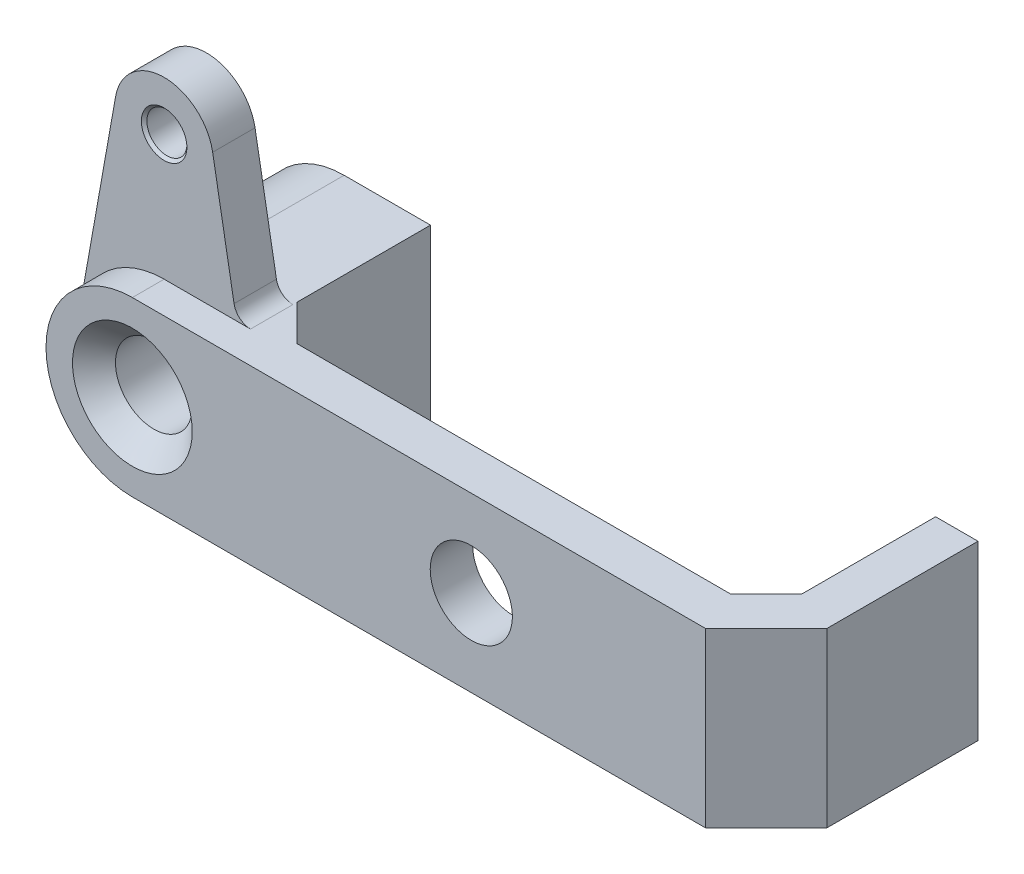
ISO-10303-21;
HEADER;
FILE_DESCRIPTION(('STEP AP214'),'2;1');
FILE_NAME('part.step','',(''),(''),'','','');
FILE_SCHEMA(('AUTOMOTIVE_DESIGN { 1 0 10303 214 1 1 1 1 }'));
ENDSEC;
DATA;
#1=APPLICATION_CONTEXT('core data for automotive mechanical design processes');
#2=APPLICATION_PROTOCOL_DEFINITION('international standard','automotive_design',2000,#1);
#3=PRODUCT_CONTEXT('',#1,'mechanical');
#4=PRODUCT('Part','Part','',(#3));
#5=PRODUCT_RELATED_PRODUCT_CATEGORY('part','',(#4));
#6=PRODUCT_DEFINITION_FORMATION('','',#4);
#7=PRODUCT_DEFINITION_CONTEXT('part definition',#1,'design');
#8=PRODUCT_DEFINITION('design','',#6,#7);
#9=PRODUCT_DEFINITION_SHAPE('','',#8);
#10=(LENGTH_UNIT() NAMED_UNIT(*) SI_UNIT(.MILLI.,.METRE.));
#11=(NAMED_UNIT(*) PLANE_ANGLE_UNIT() SI_UNIT($,.RADIAN.));
#12=(NAMED_UNIT(*) SI_UNIT($,.STERADIAN.) SOLID_ANGLE_UNIT());
#13=UNCERTAINTY_MEASURE_WITH_UNIT(LENGTH_MEASURE(1.E-05),#10,'distance_accuracy_value','');
#14=(GEOMETRIC_REPRESENTATION_CONTEXT(3) GLOBAL_UNCERTAINTY_ASSIGNED_CONTEXT((#13)) GLOBAL_UNIT_ASSIGNED_CONTEXT((#10,
#11,#12)) REPRESENTATION_CONTEXT('',''));
#15=CARTESIAN_POINT('',(0.,0.,0.));
#16=DIRECTION('',(0.,0.,1.));
#17=DIRECTION('',(1.,0.,0.));
#18=AXIS2_PLACEMENT_3D('',#15,#16,#17);
#19=CARTESIAN_POINT('',(86.3209999999999,18.6495,0.));
#20=DIRECTION('',(1.,0.,0.));
#21=DIRECTION('',(0.,1.,0.));
#22=AXIS2_PLACEMENT_3D('',#19,#20,#21);
#23=PLANE('',#22);
#24=DIRECTION('',(0.,0.,1.));
#25=VECTOR('',#24,1.);
#26=CARTESIAN_POINT('',(86.3209999999999,18.6495,0.));
#27=LINE('',#26,#25);
#28=CARTESIAN_POINT('',(86.3209999999999,18.6495,25.4));
#29=VERTEX_POINT('',#28);
#30=CARTESIAN_POINT('',(86.3209999999999,18.6495,43.4976819587423));
#31=VERTEX_POINT('',#30);
#32=EDGE_CURVE('E393',#29,#31,#27,.T.);
#33=ORIENTED_EDGE('',*,*,#32,.F.);
#34=DIRECTION('',(0.,1.,0.));
#35=VECTOR('',#34,1.);
#36=CARTESIAN_POINT('',(86.3209999999999,18.6495,25.4));
#37=LINE('',#36,#35);
#38=CARTESIAN_POINT('',(86.3209999999999,39.3505000000001,25.4));
#39=VERTEX_POINT('',#38);
#40=EDGE_CURVE('E64',#29,#39,#37,.T.);
#41=ORIENTED_EDGE('',*,*,#40,.T.);
#42=DIRECTION('',(0.,0.,1.));
#43=VECTOR('',#42,1.);
#44=CARTESIAN_POINT('',(86.3210000000002,39.3505000000001,0.));
#45=LINE('',#44,#43);
#46=CARTESIAN_POINT('',(86.3209999999999,39.3505000000001,43.4976819587422));
#47=VERTEX_POINT('',#46);
#48=EDGE_CURVE('E484',#47,#39,#45,.F.);
#49=ORIENTED_EDGE('',*,*,#48,.F.);
#50=DIRECTION('',(0.,1.,0.));
#51=VECTOR('',#50,1.);
#52=CARTESIAN_POINT('',(86.3209999999999,18.6495,43.4976819587423));
#53=LINE('',#52,#51);
#54=EDGE_CURVE('E308',#31,#47,#53,.T.);
#55=ORIENTED_EDGE('',*,*,#54,.F.);
#56=EDGE_LOOP('',(#33,#41,#49,#55));
#57=FACE_BOUND('',#56,.T.);
#58=ADVANCED_FACE('F46',(#57),#23,.T.);
#59=CARTESIAN_POINT('',(20.701,18.6495,5.08));
#60=DIRECTION('',(1.,0.,0.));
#61=DIRECTION('',(0.,0.,-1.));
#62=AXIS2_PLACEMENT_3D('',#59,#60,#61);
#63=PLANE('',#62);
#64=DIRECTION('',(0.,0.,1.));
#65=VECTOR('',#64,1.);
#66=CARTESIAN_POINT('',(20.701,18.6495,0.));
#67=LINE('',#66,#65);
#68=CARTESIAN_POINT('',(20.701,18.6495,25.4));
#69=VERTEX_POINT('',#68);
#70=CARTESIAN_POINT('',(20.701,18.6495,41.3934770618868));
#71=VERTEX_POINT('',#70);
#72=EDGE_CURVE('E198',#69,#71,#67,.T.);
#73=ORIENTED_EDGE('',*,*,#72,.F.);
#74=DIRECTION('',(0.,1.,0.));
#75=VECTOR('',#74,1.);
#76=CARTESIAN_POINT('',(20.701,18.6495,25.4));
#77=LINE('',#76,#75);
#78=CARTESIAN_POINT('',(20.701,39.3505000000001,25.4));
#79=VERTEX_POINT('',#78);
#80=EDGE_CURVE('E72',#69,#79,#77,.T.);
#81=ORIENTED_EDGE('',*,*,#80,.T.);
#82=DIRECTION('',(0.,0.,1.));
#83=VECTOR('',#82,1.);
#84=CARTESIAN_POINT('',(20.701,39.3505000000001,0.));
#85=LINE('',#84,#83);
#86=CARTESIAN_POINT('',(20.701,39.3505000000001,41.3934770618868));
#87=VERTEX_POINT('',#86);
#88=EDGE_CURVE('E331',#87,#79,#85,.F.);
#89=ORIENTED_EDGE('',*,*,#88,.F.);
#90=DIRECTION('',(0.,-1.,0.));
#91=VECTOR('',#90,1.);
#92=CARTESIAN_POINT('',(20.701,18.6495,41.3934770618868));
#93=LINE('',#92,#91);
#94=EDGE_CURVE('E330',#87,#71,#93,.T.);
#95=ORIENTED_EDGE('',*,*,#94,.T.);
#96=EDGE_LOOP('',(#73,#81,#89,#95));
#97=FACE_BOUND('',#96,.T.);
#98=ADVANCED_FACE('F545',(#97),#63,.T.);
#99=CARTESIAN_POINT('',(81.2409999999999,39.3505000000001,5.08));
#100=DIRECTION('',(-1.,0.,0.));
#101=DIRECTION('',(0.,0.,1.));
#102=AXIS2_PLACEMENT_3D('',#99,#100,#101);
#103=PLANE('',#102);
#104=DIRECTION('',(0.,0.,1.));
#105=VECTOR('',#104,1.);
#106=CARTESIAN_POINT('',(81.2409999999999,39.3505000000001,0.));
#107=LINE('',#106,#105);
#108=CARTESIAN_POINT('',(81.2409999999999,39.3505000000001,25.4));
#109=VERTEX_POINT('',#108);
#110=CARTESIAN_POINT('',(81.2409999999999,39.3505000000001,41.3934770618869));
#111=VERTEX_POINT('',#110);
#112=EDGE_CURVE('E50',#109,#111,#107,.T.);
#113=ORIENTED_EDGE('',*,*,#112,.F.);
#114=DIRECTION('',(0.,-1.,0.));
#115=VECTOR('',#114,1.);
#116=CARTESIAN_POINT('',(81.2409999999999,39.3505000000001,25.4));
#117=LINE('',#116,#115);
#118=CARTESIAN_POINT('',(81.2409999999999,18.6495,25.4));
#119=VERTEX_POINT('',#118);
#120=EDGE_CURVE('E167',#109,#119,#117,.T.);
#121=ORIENTED_EDGE('',*,*,#120,.T.);
#122=DIRECTION('',(0.,0.,1.));
#123=VECTOR('',#122,1.);
#124=CARTESIAN_POINT('',(81.2409999999999,18.6495,0.));
#125=LINE('',#124,#123);
#126=CARTESIAN_POINT('',(81.2409999999999,18.6495,41.3934770618869));
#127=VERTEX_POINT('',#126);
#128=EDGE_CURVE('E180',#127,#119,#125,.F.);
#129=ORIENTED_EDGE('',*,*,#128,.F.);
#130=DIRECTION('',(0.,1.,0.));
#131=VECTOR('',#130,1.);
#132=CARTESIAN_POINT('',(81.2409999999999,39.3505000000001,41.3934770618869));
#133=LINE('',#132,#131);
#134=EDGE_CURVE('E205',#127,#111,#133,.T.);
#135=ORIENTED_EDGE('',*,*,#134,.T.);
#136=EDGE_LOOP('',(#113,#121,#129,#135));
#137=FACE_BOUND('',#136,.T.);
#138=ADVANCED_FACE('F178',(#137),#103,.T.);
#139=CARTESIAN_POINT('',(86.3209999999999,39.3505000000001,0.));
#140=DIRECTION('',(0.,1.,0.));
#141=DIRECTION('',(-1.,0.,0.));
#142=AXIS2_PLACEMENT_3D('',#139,#140,#141);
#143=PLANE('',#142);
#144=ORIENTED_EDGE('',*,*,#48,.T.);
#145=DIRECTION('',(-1.,0.,0.));
#146=VECTOR('',#145,1.);
#147=CARTESIAN_POINT('',(86.3209999999999,39.3505000000001,25.4));
#148=LINE('',#147,#146);
#149=EDGE_CURVE('E729',#39,#109,#148,.T.);
#150=ORIENTED_EDGE('',*,*,#149,.T.);
#151=ORIENTED_EDGE('',*,*,#112,.T.);
#152=DIRECTION('',(-0.707106781186553,0.,0.707106781186542));
#153=VECTOR('',#152,1.);
#154=CARTESIAN_POINT('',(76.9304770618867,39.3505000000001,45.7040000000001));
#155=LINE('',#154,#153);
#156=CARTESIAN_POINT('',(76.9304770618867,39.3505000000001,45.7040000000001));
#157=VERTEX_POINT('',#156);
#158=EDGE_CURVE('E514',#111,#157,#155,.T.);
#159=ORIENTED_EDGE('',*,*,#158,.T.);
#160=DIRECTION('',(-1.,0.,0.));
#161=VECTOR('',#160,1.);
#162=CARTESIAN_POINT('',(86.3209999999999,39.3505000000001,45.7040000000001));
#163=LINE('',#162,#161);
#164=CARTESIAN_POINT('',(25.0115229381132,39.3505000000001,45.7040000000001));
#165=VERTEX_POINT('',#164);
#166=EDGE_CURVE('E336',#157,#165,#163,.T.);
#167=ORIENTED_EDGE('',*,*,#166,.T.);
#168=DIRECTION('',(-0.707106781186542,0.,-0.707106781186553));
#169=VECTOR('',#168,1.);
#170=CARTESIAN_POINT('',(20.701,39.3505000000001,41.3934770618868));
#171=LINE('',#170,#169);
#172=EDGE_CURVE('E511',#165,#87,#171,.T.);
#173=ORIENTED_EDGE('',*,*,#172,.T.);
#174=ORIENTED_EDGE('',*,*,#88,.T.);
#175=CARTESIAN_POINT('',(10.3505,39.3505000000001,25.4));
#176=VERTEX_POINT('',#175);
#177=EDGE_CURVE('E727',#79,#176,#148,.T.);
#178=ORIENTED_EDGE('',*,*,#177,.T.);
#179=DIRECTION('',(0.,0.,1.));
#180=VECTOR('',#179,1.);
#181=CARTESIAN_POINT('',(10.3505,39.3505000000001,0.));
#182=LINE('',#181,#180);
#183=CARTESIAN_POINT('',(10.3505,39.3505000000001,41.8940000000001));
#184=VERTEX_POINT('',#183);
#185=EDGE_CURVE('E335',#184,#176,#182,.F.);
#186=ORIENTED_EDGE('',*,*,#185,.F.);
#187=DIRECTION('',(-1.,0.,0.));
#188=VECTOR('',#187,1.);
#189=CARTESIAN_POINT('',(86.3209999999999,39.3505000000001,41.8940000000001));
#190=LINE('',#189,#188);
#191=CARTESIAN_POINT('',(20.701,39.3505000000001,41.8940000000001));
#192=VERTEX_POINT('',#191);
#193=EDGE_CURVE('E715',#192,#184,#190,.T.);
#194=ORIENTED_EDGE('',*,*,#193,.F.);
#195=DIRECTION('',(0.,0.,-1.));
#196=VECTOR('',#195,1.);
#197=CARTESIAN_POINT('',(20.701,39.3505000000001,46.9740000000001));
#198=LINE('',#197,#196);
#199=CARTESIAN_POINT('',(20.701,39.3505000000001,46.9740000000001));
#200=VERTEX_POINT('',#199);
#201=EDGE_CURVE('E532',#192,#200,#198,.F.);
#202=ORIENTED_EDGE('',*,*,#201,.T.);
#203=DIRECTION('',(-1.,0.,0.));
#204=VECTOR('',#203,1.);
#205=CARTESIAN_POINT('',(86.3209999999999,39.3505000000001,46.9740000000001));
#206=LINE('',#205,#204);
#207=CARTESIAN_POINT('',(10.3505,39.3505000000001,46.9740000000001));
#208=VERTEX_POINT('',#207);
#209=EDGE_CURVE('E488',#200,#208,#206,.T.);
#210=ORIENTED_EDGE('',*,*,#209,.T.);
#211=CARTESIAN_POINT('',(10.3505,39.3505000000001,50.7840000000001));
#212=VERTEX_POINT('',#211);
#213=EDGE_CURVE('E408',#212,#208,#182,.F.);
#214=ORIENTED_EDGE('',*,*,#213,.F.);
#215=DIRECTION('',(1.,0.,0.));
#216=VECTOR('',#215,1.);
#217=CARTESIAN_POINT('',(43.1605000000001,39.3505000000001,50.7840000000001));
#218=LINE('',#217,#216);
#219=CARTESIAN_POINT('',(79.0346819587421,39.3505000000001,50.7840000000001));
#220=VERTEX_POINT('',#219);
#221=EDGE_CURVE('E188',#220,#212,#218,.F.);
#222=ORIENTED_EDGE('',*,*,#221,.F.);
#223=DIRECTION('',(0.707106781186548,0.,-0.707106781186548));
#224=VECTOR('',#223,1.);
#225=CARTESIAN_POINT('',(80.5225795103144,39.3505000000001,49.2961024484277));
#226=LINE('',#225,#224);
#227=EDGE_CURVE('E339',#220,#47,#226,.T.);
#228=ORIENTED_EDGE('',*,*,#227,.T.);
#229=EDGE_LOOP('',(#144,#150,#151,#159,#167,#173,#174,#178,#186,#194,#202,#210,#214,#222,#228));
#230=FACE_BOUND('',#229,.T.);
#231=ADVANCED_FACE('F485',(#230),#143,.T.);
#232=CARTESIAN_POINT('',(10.3505,29.0000000000001,0.));
#233=DIRECTION('',(0.,0.,1.));
#234=DIRECTION('',(1.,0.,0.));
#235=AXIS2_PLACEMENT_3D('',#232,#233,#234);
#236=CYLINDRICAL_SURFACE('',#235,10.3505);
#237=ORIENTED_EDGE('',*,*,#185,.T.);
#238=CARTESIAN_POINT('',(10.3505,29.0000000000001,25.4));
#239=DIRECTION('',(0.,0.,-1.));
#240=DIRECTION('',(-1.,0.,0.));
#241=AXIS2_PLACEMENT_3D('',#238,#239,#240);
#242=CIRCLE('',#241,10.3505);
#243=CARTESIAN_POINT('',(10.3505,18.6495,25.4));
#244=VERTEX_POINT('',#243);
#245=EDGE_CURVE('E472',#176,#244,#242,.F.);
#246=ORIENTED_EDGE('',*,*,#245,.T.);
#247=DIRECTION('',(0.,0.,1.));
#248=VECTOR('',#247,1.);
#249=CARTESIAN_POINT('',(10.3505,18.6495,0.));
#250=LINE('',#249,#248);
#251=CARTESIAN_POINT('',(10.3505,18.6495,50.7840000000001));
#252=VERTEX_POINT('',#251);
#253=EDGE_CURVE('E396',#252,#244,#250,.F.);
#254=ORIENTED_EDGE('',*,*,#253,.F.);
#255=CARTESIAN_POINT('',(10.3505,29.0000000000001,50.7840000000001));
#256=DIRECTION('',(0.,0.,1.));
#257=DIRECTION('',(1.,0.,0.));
#258=AXIS2_PLACEMENT_3D('',#255,#256,#257);
#259=CIRCLE('',#258,10.3505);
#260=EDGE_CURVE('E195',#212,#252,#259,.T.);
#261=ORIENTED_EDGE('',*,*,#260,.F.);
#262=ORIENTED_EDGE('',*,*,#213,.T.);
#263=CARTESIAN_POINT('',(10.3505,29.0000000000001,46.9740000000001));
#264=DIRECTION('',(0.,0.,-1.));
#265=DIRECTION('',(-1.,0.,0.));
#266=AXIS2_PLACEMENT_3D('',#263,#264,#265);
#267=CIRCLE('',#266,10.3505);
#268=CARTESIAN_POINT('',(0.159724430344184,30.8113375000001,46.9740000000001));
#269=VERTEX_POINT('',#268);
#270=EDGE_CURVE('E693',#208,#269,#267,.F.);
#271=ORIENTED_EDGE('',*,*,#270,.T.);
#272=DIRECTION('',(0.,0.,1.));
#273=VECTOR('',#272,1.);
#274=CARTESIAN_POINT('',(0.159724430344189,30.8113375000001,0.));
#275=LINE('',#274,#273);
#276=CARTESIAN_POINT('',(0.159724430344184,30.8113375000001,41.8940000000001));
#277=VERTEX_POINT('',#276);
#278=EDGE_CURVE('E326',#269,#277,#275,.F.);
#279=ORIENTED_EDGE('',*,*,#278,.T.);
#280=CARTESIAN_POINT('',(10.3505,29.0000000000001,41.8940000000001));
#281=DIRECTION('',(0.,0.,-1.));
#282=DIRECTION('',(-1.,0.,0.));
#283=AXIS2_PLACEMENT_3D('',#280,#281,#282);
#284=CIRCLE('',#283,10.3505);
#285=EDGE_CURVE('E713',#184,#277,#284,.F.);
#286=ORIENTED_EDGE('',*,*,#285,.F.);
#287=EDGE_LOOP('',(#237,#246,#254,#261,#262,#271,#279,#286));
#288=FACE_BOUND('',#287,.T.);
#289=ADVANCED_FACE('F471',(#288),#236,.T.);
#290=CARTESIAN_POINT('',(10.3505,18.6495,0.));
#291=DIRECTION('',(0.,-1.,0.));
#292=DIRECTION('',(1.,0.,0.));
#293=AXIS2_PLACEMENT_3D('',#290,#291,#292);
#294=PLANE('',#293);
#295=ORIENTED_EDGE('',*,*,#253,.T.);
#296=DIRECTION('',(1.,0.,0.));
#297=VECTOR('',#296,1.);
#298=CARTESIAN_POINT('',(10.3505,18.6495,25.4));
#299=LINE('',#298,#297);
#300=EDGE_CURVE('E174',#244,#69,#299,.T.);
#301=ORIENTED_EDGE('',*,*,#300,.T.);
#302=ORIENTED_EDGE('',*,*,#72,.T.);
#303=DIRECTION('',(0.707106781186542,0.,0.707106781186553));
#304=VECTOR('',#303,1.);
#305=CARTESIAN_POINT('',(20.701,18.6495,41.3934770618868));
#306=LINE('',#305,#304);
#307=CARTESIAN_POINT('',(25.0115229381132,18.6495,45.7040000000001));
#308=VERTEX_POINT('',#307);
#309=EDGE_CURVE('E524',#71,#308,#306,.T.);
#310=ORIENTED_EDGE('',*,*,#309,.T.);
#311=DIRECTION('',(1.,0.,0.));
#312=VECTOR('',#311,1.);
#313=CARTESIAN_POINT('',(10.3505,18.6495,45.7040000000001));
#314=LINE('',#313,#312);
#315=CARTESIAN_POINT('',(76.9304770618867,18.6495,45.7040000000001));
#316=VERTEX_POINT('',#315);
#317=EDGE_CURVE('E189',#308,#316,#314,.T.);
#318=ORIENTED_EDGE('',*,*,#317,.T.);
#319=DIRECTION('',(0.707106781186553,0.,-0.707106781186542));
#320=VECTOR('',#319,1.);
#321=CARTESIAN_POINT('',(76.9304770618867,18.6495,45.7040000000001));
#322=LINE('',#321,#320);
#323=EDGE_CURVE('E186',#316,#127,#322,.T.);
#324=ORIENTED_EDGE('',*,*,#323,.T.);
#325=ORIENTED_EDGE('',*,*,#128,.T.);
#326=EDGE_CURVE('E164',#119,#29,#299,.T.);
#327=ORIENTED_EDGE('',*,*,#326,.T.);
#328=ORIENTED_EDGE('',*,*,#32,.T.);
#329=DIRECTION('',(-0.707106781186548,0.,0.707106781186548));
#330=VECTOR('',#329,1.);
#331=CARTESIAN_POINT('',(84.8331024484276,18.6495,44.9855795103146));
#332=LINE('',#331,#330);
#333=CARTESIAN_POINT('',(79.0346819587421,18.6495,50.7840000000001));
#334=VERTEX_POINT('',#333);
#335=EDGE_CURVE('E397',#31,#334,#332,.T.);
#336=ORIENTED_EDGE('',*,*,#335,.T.);
#337=DIRECTION('',(1.,0.,0.));
#338=VECTOR('',#337,1.);
#339=CARTESIAN_POINT('',(43.1605000000001,18.6495,50.7840000000001));
#340=LINE('',#339,#338);
#341=EDGE_CURVE('E304',#252,#334,#340,.T.);
#342=ORIENTED_EDGE('',*,*,#341,.F.);
#343=EDGE_LOOP('',(#295,#301,#302,#310,#318,#324,#325,#327,#328,#336,#342));
#344=FACE_BOUND('',#343,.T.);
#345=ADVANCED_FACE('F184',(#344),#294,.T.);
#346=CARTESIAN_POINT('',(10.3505,29.0000000000001,50.7840000000001));
#347=DIRECTION('',(0.,0.,1.));
#348=DIRECTION('',(1.,0.,0.));
#349=AXIS2_PLACEMENT_3D('',#346,#347,#348);
#350=CYLINDRICAL_SURFACE('',#349,4.59999999999999);
#351=CARTESIAN_POINT('',(10.3505,29.0000000000001,48.2090000000001));
#352=DIRECTION('',(0.,0.,1.));
#353=DIRECTION('',(1.,0.,0.));
#354=AXIS2_PLACEMENT_3D('',#351,#352,#353);
#355=CIRCLE('',#354,4.59999999999999);
#356=CARTESIAN_POINT('',(14.9505,29.0000000000001,48.2090000000001));
#357=VERTEX_POINT('',#356);
#358=EDGE_CURVE('E705',#357,#357,#355,.T.);
#359=ORIENTED_EDGE('',*,*,#358,.T.);
#360=EDGE_LOOP('',(#359));
#361=FACE_BOUND('',#360,.T.);
#362=CARTESIAN_POINT('',(10.3505,29.0000000000001,25.4));
#363=DIRECTION('',(0.,0.,-1.));
#364=DIRECTION('',(-1.,0.,0.));
#365=AXIS2_PLACEMENT_3D('',#362,#363,#364);
#366=CIRCLE('',#365,4.59999999999999);
#367=CARTESIAN_POINT('',(5.75050000000001,29.0000000000001,25.4));
#368=VERTEX_POINT('',#367);
#369=EDGE_CURVE('E172',#368,#368,#366,.F.);
#370=ORIENTED_EDGE('',*,*,#369,.F.);
#371=EDGE_LOOP('',(#370));
#372=FACE_BOUND('',#371,.T.);
#373=ADVANCED_FACE('F570',(#361,#372),#350,.F.);
#374=CARTESIAN_POINT('',(80.5225795103144,39.3505000000001,49.2961024484277));
#375=DIRECTION('',(-0.707106781186546,0.,-0.707106781186549));
#376=DIRECTION('',(-0.707106781186549,0.,0.707106781186546));
#377=AXIS2_PLACEMENT_3D('',#374,#375,#376);
#378=PLANE('',#377);
#379=ORIENTED_EDGE('',*,*,#335,.F.);
#380=ORIENTED_EDGE('',*,*,#54,.T.);
#381=ORIENTED_EDGE('',*,*,#227,.F.);
#382=DIRECTION('',(0.,1.,0.));
#383=VECTOR('',#382,1.);
#384=CARTESIAN_POINT('',(79.0346819587421,39.3505000000001,50.7840000000001));
#385=LINE('',#384,#383);
#386=EDGE_CURVE('E321',#334,#220,#385,.T.);
#387=ORIENTED_EDGE('',*,*,#386,.F.);
#388=EDGE_LOOP('',(#379,#380,#381,#387));
#389=FACE_BOUND('',#388,.T.);
#390=ADVANCED_FACE('F479',(#389),#378,.F.);
#391=CARTESIAN_POINT('',(43.1605000000001,29.0000000000001,45.7040000000001));
#392=DIRECTION('',(0.,0.,1.));
#393=DIRECTION('',(1.,0.,0.));
#394=AXIS2_PLACEMENT_3D('',#391,#392,#393);
#395=PLANE('',#394);
#396=CARTESIAN_POINT('',(50.9710000000001,29.0000000000001,45.7040000000001));
#397=DIRECTION('',(0.,0.,-1.));
#398=DIRECTION('',(-1.,0.,0.));
#399=AXIS2_PLACEMENT_3D('',#396,#397,#398);
#400=CIRCLE('',#399,4.92124999999999);
#401=CARTESIAN_POINT('',(46.0497500000001,29.0000000000001,45.7040000000001));
#402=VERTEX_POINT('',#401);
#403=EDGE_CURVE('E716',#402,#402,#400,.T.);
#404=ORIENTED_EDGE('',*,*,#403,.F.);
#405=EDGE_LOOP('',(#404));
#406=FACE_BOUND('',#405,.T.);
#407=ORIENTED_EDGE('',*,*,#317,.F.);
#408=DIRECTION('',(0.,1.,0.));
#409=VECTOR('',#408,1.);
#410=CARTESIAN_POINT('',(25.0115229381132,29.0000000000001,45.7040000000001));
#411=LINE('',#410,#409);
#412=EDGE_CURVE('E203',#308,#165,#411,.T.);
#413=ORIENTED_EDGE('',*,*,#412,.T.);
#414=ORIENTED_EDGE('',*,*,#166,.F.);
#415=DIRECTION('',(0.,-1.,0.));
#416=VECTOR('',#415,1.);
#417=CARTESIAN_POINT('',(76.9304770618867,29.0000000000001,45.7040000000001));
#418=LINE('',#417,#416);
#419=EDGE_CURVE('E546',#157,#316,#418,.T.);
#420=ORIENTED_EDGE('',*,*,#419,.T.);
#421=EDGE_LOOP('',(#407,#413,#414,#420));
#422=FACE_BOUND('',#421,.T.);
#423=ADVANCED_FACE('F569',(#406,#422),#395,.F.);
#424=CARTESIAN_POINT('',(43.1605000000001,29.0000000000001,50.7840000000001));
#425=DIRECTION('',(0.,0.,1.));
#426=DIRECTION('',(1.,0.,0.));
#427=AXIS2_PLACEMENT_3D('',#424,#425,#426);
#428=PLANE('',#427);
#429=CARTESIAN_POINT('',(10.3505,29.0000000000001,50.7840000000001));
#430=DIRECTION('',(0.,0.,1.));
#431=DIRECTION('',(1.,0.,0.));
#432=AXIS2_PLACEMENT_3D('',#429,#430,#431);
#433=CIRCLE('',#432,7.175);
#434=CARTESIAN_POINT('',(17.5255,29.0000000000001,50.7840000000001));
#435=VERTEX_POINT('',#434);
#436=EDGE_CURVE('E746',#435,#435,#433,.T.);
#437=ORIENTED_EDGE('',*,*,#436,.F.);
#438=EDGE_LOOP('',(#437));
#439=FACE_BOUND('',#438,.T.);
#440=CARTESIAN_POINT('',(50.9710000000001,29.0000000000001,50.7840000000001));
#441=DIRECTION('',(0.,0.,-1.));
#442=DIRECTION('',(-1.,0.,0.));
#443=AXIS2_PLACEMENT_3D('',#440,#441,#442);
#444=CIRCLE('',#443,4.92124999999999);
#445=CARTESIAN_POINT('',(46.0497500000001,29.0000000000001,50.7840000000001));
#446=VERTEX_POINT('',#445);
#447=EDGE_CURVE('E309',#446,#446,#444,.T.);
#448=ORIENTED_EDGE('',*,*,#447,.T.);
#449=EDGE_LOOP('',(#448));
#450=FACE_BOUND('',#449,.T.);
#451=ORIENTED_EDGE('',*,*,#260,.T.);
#452=ORIENTED_EDGE('',*,*,#341,.T.);
#453=ORIENTED_EDGE('',*,*,#386,.T.);
#454=ORIENTED_EDGE('',*,*,#221,.T.);
#455=EDGE_LOOP('',(#451,#452,#453,#454));
#456=FACE_BOUND('',#455,.T.);
#457=ADVANCED_FACE('F463',(#439,#450,#456),#428,.T.);
#458=CARTESIAN_POINT('',(50.9710000000001,29.0000000000001,45.7040000000001));
#459=DIRECTION('',(0.,0.,-1.));
#460=DIRECTION('',(-1.,0.,0.));
#461=AXIS2_PLACEMENT_3D('',#458,#459,#460);
#462=CYLINDRICAL_SURFACE('',#461,4.92124999999999);
#463=ORIENTED_EDGE('',*,*,#447,.F.);
#464=EDGE_LOOP('',(#463));
#465=FACE_BOUND('',#464,.T.);
#466=ORIENTED_EDGE('',*,*,#403,.T.);
#467=EDGE_LOOP('',(#466));
#468=FACE_BOUND('',#467,.T.);
#469=ADVANCED_FACE('F571',(#465,#468),#462,.F.);
#470=CARTESIAN_POINT('',(0.159724430344182,30.8113375000001,44.4340000000001));
#471=DIRECTION('',(-0.98456843337576,0.175000000000002,0.));
#472=DIRECTION('',(0.175000000000002,0.98456843337576,0.));
#473=AXIS2_PLACEMENT_3D('',#470,#471,#472);
#474=PLANE('',#473);
#475=ORIENTED_EDGE('',*,*,#278,.F.);
#476=DIRECTION('',(0.175000000000002,0.98456843337576,0.));
#477=VECTOR('',#476,1.);
#478=CARTESIAN_POINT('',(0.159724430344182,30.8113375000001,46.9740000000001));
#479=LINE('',#478,#477);
#480=CARTESIAN_POINT('',(4.53613111669949,55.4334625000001,46.9740000000001));
#481=VERTEX_POINT('',#480);
#482=EDGE_CURVE('E698',#269,#481,#479,.T.);
#483=ORIENTED_EDGE('',*,*,#482,.T.);
#484=DIRECTION('',(0.,0.,-1.));
#485=VECTOR('',#484,1.);
#486=CARTESIAN_POINT('',(4.53613111669949,55.4334625000001,44.4340000000001));
#487=LINE('',#486,#485);
#488=CARTESIAN_POINT('',(4.53613111669949,55.4334625000001,41.8940000000001));
#489=VERTEX_POINT('',#488);
#490=EDGE_CURVE('E687',#481,#489,#487,.T.);
#491=ORIENTED_EDGE('',*,*,#490,.T.);
#492=DIRECTION('',(0.175000000000002,0.98456843337576,0.));
#493=VECTOR('',#492,1.);
#494=CARTESIAN_POINT('',(0.159724430344182,30.8113375000001,41.8940000000001));
#495=LINE('',#494,#493);
#496=EDGE_CURVE('E709',#277,#489,#495,.T.);
#497=ORIENTED_EDGE('',*,*,#496,.F.);
#498=EDGE_LOOP('',(#475,#483,#491,#497));
#499=FACE_BOUND('',#498,.T.);
#500=ADVANCED_FACE('F583',(#499),#474,.T.);
#501=CARTESIAN_POINT('',(16.1648688833005,55.4334625000001,44.4340000000001));
#502=DIRECTION('',(0.984568433375761,0.175,0.));
#503=DIRECTION('',(0.175,-0.984568433375761,0.));
#504=AXIS2_PLACEMENT_3D('',#501,#502,#503);
#505=PLANE('',#504);
#506=DIRECTION('',(0.175,-0.984568433375761,0.));
#507=VECTOR('',#506,1.);
#508=CARTESIAN_POINT('',(16.1648688833005,55.4334625000001,46.9740000000001));
#509=LINE('',#508,#507);
#510=CARTESIAN_POINT('',(16.1648688833005,55.4334625000001,46.9740000000001));
#511=VERTEX_POINT('',#510);
#512=CARTESIAN_POINT('',(18.7299380696557,41.002113069656,46.9740000000001));
#513=VERTEX_POINT('',#512);
#514=EDGE_CURVE('E701',#511,#513,#509,.T.);
#515=ORIENTED_EDGE('',*,*,#514,.T.);
#516=DIRECTION('',(0.,0.,-1.));
#517=VECTOR('',#516,1.);
#518=CARTESIAN_POINT('',(18.7299380696557,41.002113069656,41.8940000000001));
#519=LINE('',#518,#517);
#520=CARTESIAN_POINT('',(18.7299380696557,41.002113069656,41.8940000000001));
#521=VERTEX_POINT('',#520);
#522=EDGE_CURVE('E529',#513,#521,#519,.T.);
#523=ORIENTED_EDGE('',*,*,#522,.T.);
#524=DIRECTION('',(0.175,-0.984568433375761,0.));
#525=VECTOR('',#524,1.);
#526=CARTESIAN_POINT('',(16.1648688833005,55.4334625000001,41.8940000000001));
#527=LINE('',#526,#525);
#528=CARTESIAN_POINT('',(16.1648688833005,55.4334625000001,41.8940000000001));
#529=VERTEX_POINT('',#528);
#530=EDGE_CURVE('E703',#529,#521,#527,.T.);
#531=ORIENTED_EDGE('',*,*,#530,.F.);
#532=DIRECTION('',(0.,0.,-1.));
#533=VECTOR('',#532,1.);
#534=CARTESIAN_POINT('',(16.1648688833005,55.4334625000001,44.4340000000001));
#535=LINE('',#534,#533);
#536=EDGE_CURVE('E694',#511,#529,#535,.T.);
#537=ORIENTED_EDGE('',*,*,#536,.F.);
#538=EDGE_LOOP('',(#515,#523,#531,#537));
#539=FACE_BOUND('',#538,.T.);
#540=ADVANCED_FACE('F589',(#539),#505,.T.);
#541=CARTESIAN_POINT('',(43.1605,44.4621984611791,46.9740000000001));
#542=DIRECTION('',(0.,0.,-1.));
#543=DIRECTION('',(-1.,0.,0.));
#544=AXIS2_PLACEMENT_3D('',#541,#542,#543);
#545=PLANE('',#544);
#546=CARTESIAN_POINT('',(10.3505,54.4000000000001,46.9740000000001));
#547=DIRECTION('',(0.,0.,-1.));
#548=DIRECTION('',(-1.,0.,0.));
#549=AXIS2_PLACEMENT_3D('',#546,#547,#548);
#550=CIRCLE('',#549,2.7305);
#551=CARTESIAN_POINT('',(7.62,54.4000000000001,46.9740000000001));
#552=VERTEX_POINT('',#551);
#553=EDGE_CURVE('E730',#552,#552,#550,.T.);
#554=ORIENTED_EDGE('',*,*,#553,.T.);
#555=EDGE_LOOP('',(#554));
#556=FACE_BOUND('',#555,.T.);
#557=ORIENTED_EDGE('',*,*,#209,.F.);
#558=CARTESIAN_POINT('',(20.701,41.3524552359466,46.9740000000001));
#559=DIRECTION('',(0.,0.,-1.));
#560=DIRECTION('',(-1.,0.,0.));
#561=AXIS2_PLACEMENT_3D('',#558,#559,#560);
#562=CIRCLE('',#561,2.00195523594651);
#563=EDGE_CURVE('E12',#200,#513,#562,.T.);
#564=ORIENTED_EDGE('',*,*,#563,.T.);
#565=ORIENTED_EDGE('',*,*,#514,.F.);
#566=CARTESIAN_POINT('',(10.3505,54.4000000000001,46.9740000000001));
#567=DIRECTION('',(0.,0.,-1.));
#568=DIRECTION('',(-1.,0.,0.));
#569=AXIS2_PLACEMENT_3D('',#566,#567,#568);
#570=CIRCLE('',#569,5.90549999999995);
#571=EDGE_CURVE('E689',#481,#511,#570,.T.);
#572=ORIENTED_EDGE('',*,*,#571,.F.);
#573=ORIENTED_EDGE('',*,*,#482,.F.);
#574=ORIENTED_EDGE('',*,*,#270,.F.);
#575=EDGE_LOOP('',(#557,#564,#565,#572,#573,#574));
#576=FACE_BOUND('',#575,.T.);
#577=ADVANCED_FACE('F673',(#556,#576),#545,.F.);
#578=CARTESIAN_POINT('',(10.3505,54.4000000000001,44.4340000000001));
#579=DIRECTION('',(0.,0.,-1.));
#580=DIRECTION('',(-1.,0.,0.));
#581=AXIS2_PLACEMENT_3D('',#578,#579,#580);
#582=CYLINDRICAL_SURFACE('',#581,5.90549999999995);
#583=ORIENTED_EDGE('',*,*,#490,.F.);
#584=ORIENTED_EDGE('',*,*,#571,.T.);
#585=ORIENTED_EDGE('',*,*,#536,.T.);
#586=CARTESIAN_POINT('',(10.3505,54.4000000000001,41.8940000000001));
#587=DIRECTION('',(0.,0.,-1.));
#588=DIRECTION('',(-1.,0.,0.));
#589=AXIS2_PLACEMENT_3D('',#586,#587,#588);
#590=CIRCLE('',#589,5.90549999999995);
#591=EDGE_CURVE('E691',#489,#529,#590,.T.);
#592=ORIENTED_EDGE('',*,*,#591,.F.);
#593=EDGE_LOOP('',(#583,#584,#585,#592));
#594=FACE_BOUND('',#593,.T.);
#595=ADVANCED_FACE('F671',(#594),#582,.T.);
#596=CARTESIAN_POINT('',(43.1605,44.4621984611791,41.8940000000001));
#597=DIRECTION('',(0.,0.,-1.));
#598=DIRECTION('',(-1.,0.,0.));
#599=AXIS2_PLACEMENT_3D('',#596,#597,#598);
#600=PLANE('',#599);
#601=CARTESIAN_POINT('',(10.3505,54.4000000000001,41.8940000000001));
#602=DIRECTION('',(0.,0.,-1.));
#603=DIRECTION('',(-1.,0.,0.));
#604=AXIS2_PLACEMENT_3D('',#601,#602,#603);
#605=CIRCLE('',#604,2.7305);
#606=CARTESIAN_POINT('',(7.62,54.4000000000001,41.8940000000001));
#607=VERTEX_POINT('',#606);
#608=EDGE_CURVE('E737',#607,#607,#605,.T.);
#609=ORIENTED_EDGE('',*,*,#608,.F.);
#610=EDGE_LOOP('',(#609));
#611=FACE_BOUND('',#610,.T.);
#612=ORIENTED_EDGE('',*,*,#530,.T.);
#613=CARTESIAN_POINT('',(20.701,41.3524552359466,41.8940000000001));
#614=DIRECTION('',(0.,0.,-1.));
#615=DIRECTION('',(-1.,0.,0.));
#616=AXIS2_PLACEMENT_3D('',#613,#614,#615);
#617=CIRCLE('',#616,2.00195523594651);
#618=EDGE_CURVE('E56',#521,#192,#617,.F.);
#619=ORIENTED_EDGE('',*,*,#618,.T.);
#620=ORIENTED_EDGE('',*,*,#193,.T.);
#621=ORIENTED_EDGE('',*,*,#285,.T.);
#622=ORIENTED_EDGE('',*,*,#496,.T.);
#623=ORIENTED_EDGE('',*,*,#591,.T.);
#624=EDGE_LOOP('',(#612,#619,#620,#621,#622,#623));
#625=FACE_BOUND('',#624,.T.);
#626=ADVANCED_FACE('F556',(#611,#625),#600,.T.);
#627=CARTESIAN_POINT('',(20.701,18.6495,41.3934770618868));
#628=DIRECTION('',(-0.707106781186553,0.,0.707106781186542));
#629=DIRECTION('',(0.,-1.,0.));
#630=AXIS2_PLACEMENT_3D('',#627,#628,#629);
#631=PLANE('',#630);
#632=ORIENTED_EDGE('',*,*,#172,.F.);
#633=ORIENTED_EDGE('',*,*,#412,.F.);
#634=ORIENTED_EDGE('',*,*,#309,.F.);
#635=ORIENTED_EDGE('',*,*,#94,.F.);
#636=EDGE_LOOP('',(#632,#633,#634,#635));
#637=FACE_BOUND('',#636,.T.);
#638=ADVANCED_FACE('F521',(#637),#631,.F.);
#639=CARTESIAN_POINT('',(76.9304770618867,29.0000000000001,45.7040000000001));
#640=DIRECTION('',(0.707106781186542,0.,0.707106781186553));
#641=DIRECTION('',(0.,-1.,0.));
#642=AXIS2_PLACEMENT_3D('',#639,#640,#641);
#643=PLANE('',#642);
#644=ORIENTED_EDGE('',*,*,#158,.F.);
#645=ORIENTED_EDGE('',*,*,#134,.F.);
#646=ORIENTED_EDGE('',*,*,#323,.F.);
#647=ORIENTED_EDGE('',*,*,#419,.F.);
#648=EDGE_LOOP('',(#644,#645,#646,#647));
#649=FACE_BOUND('',#648,.T.);
#650=ADVANCED_FACE('F548',(#649),#643,.F.);
#651=CARTESIAN_POINT('',(20.701,41.3524552359466,44.4340000000001));
#652=DIRECTION('',(0.,0.,1.));
#653=DIRECTION('',(1.,0.,0.));
#654=AXIS2_PLACEMENT_3D('',#651,#652,#653);
#655=CYLINDRICAL_SURFACE('',#654,2.00195523594651);
#656=ORIENTED_EDGE('',*,*,#563,.F.);
#657=ORIENTED_EDGE('',*,*,#201,.F.);
#658=ORIENTED_EDGE('',*,*,#618,.F.);
#659=ORIENTED_EDGE('',*,*,#522,.F.);
#660=EDGE_LOOP('',(#656,#657,#658,#659));
#661=FACE_BOUND('',#660,.T.);
#662=ADVANCED_FACE('F48',(#661),#655,.F.);
#663=CARTESIAN_POINT('',(10.3505,29.0000000000001,50.7840000000001));
#664=DIRECTION('',(0.,0.,1.));
#665=DIRECTION('',(1.,0.,0.));
#666=AXIS2_PLACEMENT_3D('',#663,#664,#665);
#667=CONICAL_SURFACE('',#666,7.175,0.785398163397449);
#668=ORIENTED_EDGE('',*,*,#358,.F.);
#669=EDGE_LOOP('',(#668));
#670=FACE_BOUND('',#669,.T.);
#671=ORIENTED_EDGE('',*,*,#436,.T.);
#672=EDGE_LOOP('',(#671));
#673=FACE_BOUND('',#672,.T.);
#674=ADVANCED_FACE('F554',(#670,#673),#667,.F.);
#675=CARTESIAN_POINT('',(10.3505,54.4000000000001,46.6435));
#676=DIRECTION('',(0.,0.,1.));
#677=DIRECTION('',(1.,0.,0.));
#678=AXIS2_PLACEMENT_3D('',#675,#676,#677);
#679=CONICAL_SURFACE('',#678,2.39999999999999,0.785398163397451);
#680=ORIENTED_EDGE('',*,*,#553,.F.);
#681=EDGE_LOOP('',(#680));
#682=FACE_BOUND('',#681,.T.);
#683=CARTESIAN_POINT('',(10.3505,54.4000000000001,46.6435));
#684=DIRECTION('',(0.,0.,-1.));
#685=DIRECTION('',(-1.,0.,0.));
#686=AXIS2_PLACEMENT_3D('',#683,#684,#685);
#687=CIRCLE('',#686,2.39999999999999);
#688=CARTESIAN_POINT('',(7.95050000000001,54.4000000000001,46.6435));
#689=VERTEX_POINT('',#688);
#690=EDGE_CURVE('E743',#689,#689,#687,.T.);
#691=ORIENTED_EDGE('',*,*,#690,.T.);
#692=EDGE_LOOP('',(#691));
#693=FACE_BOUND('',#692,.T.);
#694=ADVANCED_FACE('F661',(#682,#693),#679,.F.);
#695=CARTESIAN_POINT('',(10.3505,54.4000000000001,41.8940000000001));
#696=DIRECTION('',(0.,0.,-1.));
#697=DIRECTION('',(-1.,0.,0.));
#698=AXIS2_PLACEMENT_3D('',#695,#696,#697);
#699=CYLINDRICAL_SURFACE('',#698,2.39999999999999);
#700=ORIENTED_EDGE('',*,*,#690,.F.);
#701=EDGE_LOOP('',(#700));
#702=FACE_BOUND('',#701,.T.);
#703=CARTESIAN_POINT('',(10.3505,54.4000000000001,42.2245000000001));
#704=DIRECTION('',(0.,0.,-1.));
#705=DIRECTION('',(-1.,0.,0.));
#706=AXIS2_PLACEMENT_3D('',#703,#704,#705);
#707=CIRCLE('',#706,2.39999999999999);
#708=CARTESIAN_POINT('',(7.95050000000001,54.4000000000001,42.2245000000001));
#709=VERTEX_POINT('',#708);
#710=EDGE_CURVE('E740',#709,#709,#707,.T.);
#711=ORIENTED_EDGE('',*,*,#710,.T.);
#712=EDGE_LOOP('',(#711));
#713=FACE_BOUND('',#712,.T.);
#714=ADVANCED_FACE('F657',(#702,#713),#699,.F.);
#715=CARTESIAN_POINT('',(10.3505,54.4000000000001,41.8940000000001));
#716=DIRECTION('',(0.,0.,-1.));
#717=DIRECTION('',(-1.,0.,0.));
#718=AXIS2_PLACEMENT_3D('',#715,#716,#717);
#719=CONICAL_SURFACE('',#718,2.7305,0.785398163397451);
#720=ORIENTED_EDGE('',*,*,#710,.F.);
#721=EDGE_LOOP('',(#720));
#722=FACE_BOUND('',#721,.T.);
#723=ORIENTED_EDGE('',*,*,#608,.T.);
#724=EDGE_LOOP('',(#723));
#725=FACE_BOUND('',#724,.T.);
#726=ADVANCED_FACE('F642',(#722,#725),#719,.F.);
#727=CARTESIAN_POINT('',(0.,0.,25.4));
#728=DIRECTION('',(0.,0.,-1.));
#729=DIRECTION('',(-1.,0.,0.));
#730=AXIS2_PLACEMENT_3D('',#727,#728,#729);
#731=PLANE('',#730);
#732=ORIENTED_EDGE('',*,*,#300,.F.);
#733=ORIENTED_EDGE('',*,*,#245,.F.);
#734=ORIENTED_EDGE('',*,*,#177,.F.);
#735=ORIENTED_EDGE('',*,*,#80,.F.);
#736=EDGE_LOOP('',(#732,#733,#734,#735));
#737=FACE_BOUND('',#736,.T.);
#738=ORIENTED_EDGE('',*,*,#369,.T.);
#739=EDGE_LOOP('',(#738));
#740=FACE_BOUND('',#739,.T.);
#741=ADVANCED_FACE('F637',(#737,#740),#731,.T.);
#742=ORIENTED_EDGE('',*,*,#40,.F.);
#743=ORIENTED_EDGE('',*,*,#326,.F.);
#744=ORIENTED_EDGE('',*,*,#120,.F.);
#745=ORIENTED_EDGE('',*,*,#149,.F.);
#746=EDGE_LOOP('',(#742,#743,#744,#745));
#747=FACE_BOUND('',#746,.T.);
#748=ADVANCED_FACE('F166',(#747),#731,.T.);
#749=CLOSED_SHELL('',(#58,#98,#138,#231,#289,#345,#373,#390,#423,#457,#469,#500,#540,#577,#595,
#626,#638,#650,#662,#674,#694,#714,#726,#741,#748));
#750=MANIFOLD_SOLID_BREP('B2',#749);
#751=ADVANCED_BREP_SHAPE_REPRESENTATION('',(#18,#750),#14);
#752=SHAPE_DEFINITION_REPRESENTATION(#9,#751);
ENDSEC;
END-ISO-10303-21;
